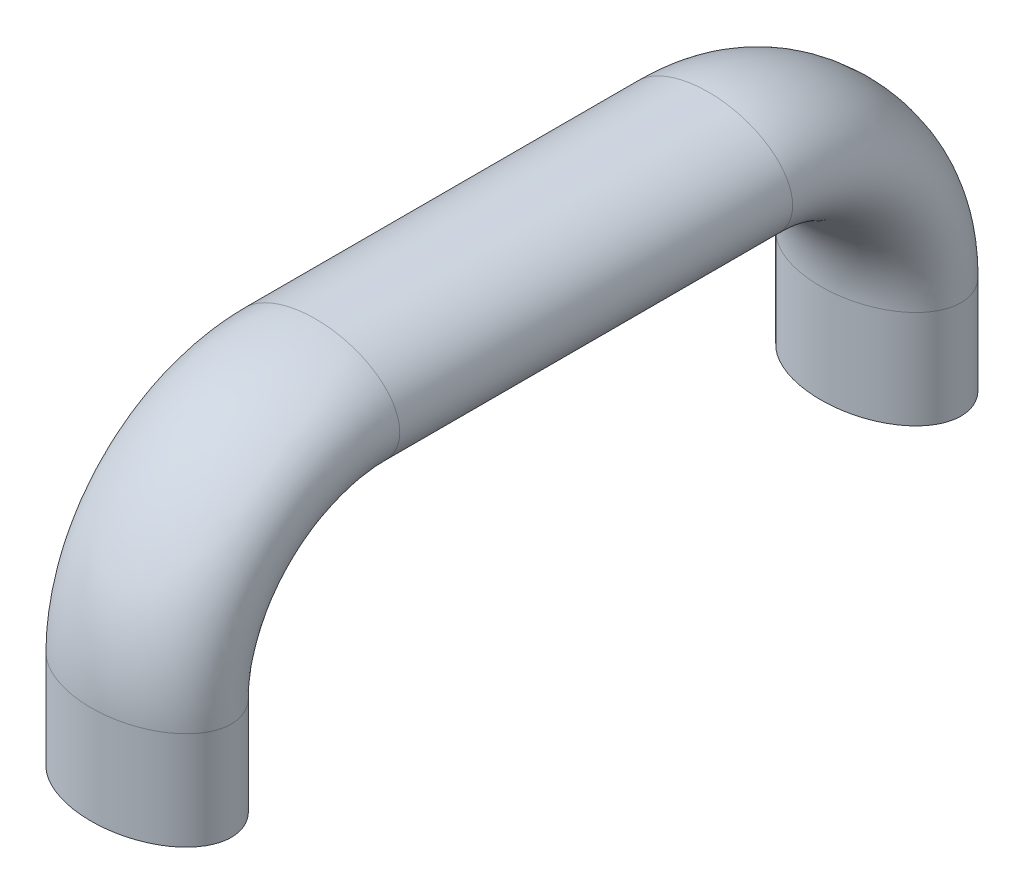
ISO-10303-21;
HEADER;
FILE_DESCRIPTION(('STEP AP214'),'2;1');
FILE_NAME('part.step','',(''),(''),'','','');
FILE_SCHEMA(('AUTOMOTIVE_DESIGN { 1 0 10303 214 1 1 1 1 }'));
ENDSEC;
DATA;
#1=APPLICATION_CONTEXT('core data for automotive mechanical design processes');
#2=APPLICATION_PROTOCOL_DEFINITION('international standard','automotive_design',2000,#1);
#3=PRODUCT_CONTEXT('',#1,'mechanical');
#4=PRODUCT('Part','Part','',(#3));
#5=PRODUCT_RELATED_PRODUCT_CATEGORY('part','',(#4));
#6=PRODUCT_DEFINITION_FORMATION('','',#4);
#7=PRODUCT_DEFINITION_CONTEXT('part definition',#1,'design');
#8=PRODUCT_DEFINITION('design','',#6,#7);
#9=PRODUCT_DEFINITION_SHAPE('','',#8);
#10=(LENGTH_UNIT() NAMED_UNIT(*) SI_UNIT(.MILLI.,.METRE.));
#11=(NAMED_UNIT(*) PLANE_ANGLE_UNIT() SI_UNIT($,.RADIAN.));
#12=(NAMED_UNIT(*) SI_UNIT($,.STERADIAN.) SOLID_ANGLE_UNIT());
#13=UNCERTAINTY_MEASURE_WITH_UNIT(LENGTH_MEASURE(1.E-05),#10,'distance_accuracy_value','');
#14=(GEOMETRIC_REPRESENTATION_CONTEXT(3) GLOBAL_UNCERTAINTY_ASSIGNED_CONTEXT((#13)) GLOBAL_UNIT_ASSIGNED_CONTEXT((#10,
#11,#12)) REPRESENTATION_CONTEXT('',''));
#15=CARTESIAN_POINT('',(0.,0.,0.));
#16=DIRECTION('',(0.,0.,1.));
#17=DIRECTION('',(1.,0.,0.));
#18=AXIS2_PLACEMENT_3D('',#15,#16,#17);
#19=CARTESIAN_POINT('',(0.,0.,-130.));
#20=DIRECTION('',(0.,-1.,0.));
#21=DIRECTION('',(0.,0.,-1.));
#22=AXIS2_PLACEMENT_3D('',#19,#20,#21);
#23=PLANE('',#22);
#24=CARTESIAN_POINT('',(0.,0.,-130.));
#25=DIRECTION('',(0.,-1.,0.));
#26=DIRECTION('',(1.,0.,0.));
#27=AXIS2_PLACEMENT_3D('',#24,#25,#26);
#28=ELLIPSE('',#27,15.,10.);
#29=CARTESIAN_POINT('',(15.,0.,-130.));
#30=VERTEX_POINT('',#29);
#31=EDGE_CURVE('E54',#30,#30,#28,.T.);
#32=ORIENTED_EDGE('',*,*,#31,.T.);
#33=EDGE_LOOP('',(#32));
#34=FACE_BOUND('',#33,.T.);
#35=ADVANCED_FACE('F42',(#34),#23,.T.);
#36=CARTESIAN_POINT('',(0.,0.,0.));
#37=DIRECTION('',(0.,1.,0.));
#38=DIRECTION('',(0.,0.,1.));
#39=AXIS2_PLACEMENT_3D('',#36,#37,#38);
#40=PLANE('',#39);
#41=CARTESIAN_POINT('',(0.,0.,0.));
#42=DIRECTION('',(0.,1.,0.));
#43=DIRECTION('',(1.,0.,0.));
#44=AXIS2_PLACEMENT_3D('',#41,#42,#43);
#45=ELLIPSE('',#44,15.,10.);
#46=CARTESIAN_POINT('',(15.,0.,0.));
#47=VERTEX_POINT('',#46);
#48=EDGE_CURVE('E13',#47,#47,#45,.T.);
#49=ORIENTED_EDGE('',*,*,#48,.F.);
#50=EDGE_LOOP('',(#49));
#51=FACE_BOUND('',#50,.T.);
#52=ADVANCED_FACE('F60',(#51),#40,.F.);
#53=CARTESIAN_POINT('',(15.,0.,-130.));
#54=CARTESIAN_POINT('',(15.,17.5,-130.));
#55=CARTESIAN_POINT('',(15.,0.,-110.));
#56=CARTESIAN_POINT('',(15.,17.5,-110.));
#57=CARTESIAN_POINT('',(-15.,0.,-110.));
#58=CARTESIAN_POINT('',(-15.,17.5,-110.));
#59=CARTESIAN_POINT('',(-15.,0.,-130.));
#60=CARTESIAN_POINT('',(-15.,17.5,-130.));
#61=CARTESIAN_POINT('',(-15.,0.,-150.));
#62=CARTESIAN_POINT('',(-15.,17.5,-150.));
#63=CARTESIAN_POINT('',(15.,0.,-150.));
#64=CARTESIAN_POINT('',(15.,17.5,-150.));
#65=CARTESIAN_POINT('',(15.,0.,-130.));
#66=CARTESIAN_POINT('',(15.,17.5,-130.));
#67=(BOUNDED_SURFACE() B_SPLINE_SURFACE(3,1,((#53,#54),(#55,#56),(#57,#58),(#59,#60),(#61,#62),
(#63,#64),(#65,#66)),.UNSPECIFIED.,.T.,.F.,.F.) B_SPLINE_SURFACE_WITH_KNOTS((4,3,4),(2,2),(0.,
0.5,1.),(0.,1.),.UNSPECIFIED.) GEOMETRIC_REPRESENTATION_ITEM() RATIONAL_B_SPLINE_SURFACE(((1.,
1.),(0.333333333333333,0.333333333333333),(0.333333333333333,0.333333333333333),(1.,1.),
(0.333333333333333,0.333333333333333),(0.333333333333333,0.333333333333333),(1.,1.))) REPRESENTATION_ITEM('') SURFACE());
#68=CARTESIAN_POINT('',(0.,17.5,-130.));
#69=DIRECTION('',(0.,-1.,0.));
#70=DIRECTION('',(1.,0.,0.));
#71=AXIS2_PLACEMENT_3D('',#68,#69,#70);
#72=ELLIPSE('',#71,15.,10.);
#73=CARTESIAN_POINT('',(15.,17.5,-130.));
#74=VERTEX_POINT('',#73);
#75=EDGE_CURVE('E129',#74,#74,#72,.T.);
#76=ORIENTED_EDGE('',*,*,#75,.T.);
#77=EDGE_LOOP('',(#76));
#78=FACE_BOUND('',#77,.T.);
#79=ORIENTED_EDGE('',*,*,#31,.F.);
#80=EDGE_LOOP('',(#79));
#81=FACE_BOUND('',#80,.T.);
#82=ADVANCED_FACE('F62',(#78,#81),#67,.F.);
#83=CARTESIAN_POINT('',(15.,17.5,-130.));
#84=CARTESIAN_POINT('',(15.,35.0735931288072,-130.));
#85=CARTESIAN_POINT('',(15.,47.5,-117.573593128807));
#86=CARTESIAN_POINT('',(15.,47.5,-100.));
#87=CARTESIAN_POINT('',(15.,17.5,-110.));
#88=CARTESIAN_POINT('',(15.,23.3578643762691,-110.));
#89=CARTESIAN_POINT('',(15.,27.5,-105.857864376269));
#90=CARTESIAN_POINT('',(15.,27.5,-100.));
#91=CARTESIAN_POINT('',(-15.,17.5,-110.));
#92=CARTESIAN_POINT('',(-15.,23.3578643762691,-110.));
#93=CARTESIAN_POINT('',(-15.,27.5,-105.857864376269));
#94=CARTESIAN_POINT('',(-15.,27.5,-100.));
#95=CARTESIAN_POINT('',(-15.,17.5,-130.));
#96=CARTESIAN_POINT('',(-15.,35.0735931288072,-130.));
#97=CARTESIAN_POINT('',(-15.,47.5,-117.573593128807));
#98=CARTESIAN_POINT('',(-15.,47.5,-100.));
#99=CARTESIAN_POINT('',(-15.,17.5,-150.));
#100=CARTESIAN_POINT('',(-15.,46.7893218813453,-150.));
#101=CARTESIAN_POINT('',(-15.,67.5,-129.289321881345));
#102=CARTESIAN_POINT('',(-15.,67.5,-100.));
#103=CARTESIAN_POINT('',(15.,17.5,-150.));
#104=CARTESIAN_POINT('',(15.,46.7893218813453,-150.));
#105=CARTESIAN_POINT('',(15.,67.5,-129.289321881345));
#106=CARTESIAN_POINT('',(15.,67.5,-100.));
#107=CARTESIAN_POINT('',(15.,17.5,-130.));
#108=CARTESIAN_POINT('',(15.,35.0735931288072,-130.));
#109=CARTESIAN_POINT('',(15.,47.5,-117.573593128807));
#110=CARTESIAN_POINT('',(15.,47.5,-100.));
#111=(BOUNDED_SURFACE() B_SPLINE_SURFACE(3,3,((#83,#84,#85,#86),(#87,#88,#89,#90),(#91,#92,#93,
#94),(#95,#96,#97,#98),(#99,#100,#101,#102),(#103,#104,#105,#106),(#107,#108,#109,#110)),
.UNSPECIFIED.,.T.,.F.,.F.) B_SPLINE_SURFACE_WITH_KNOTS((4,3,4),(4,4),(0.,0.5,1.),(0.,1.),
.UNSPECIFIED.) GEOMETRIC_REPRESENTATION_ITEM() RATIONAL_B_SPLINE_SURFACE(((1.,0.804737854124365,
0.804737854124365,1.),(0.333333333333333,0.268245951374788,0.268245951374788,0.333333333333333),
(0.333333333333333,0.268245951374788,0.268245951374788,0.333333333333333),(1.,0.804737854124365,
0.804737854124365,1.),(0.333333333333333,0.268245951374788,0.268245951374788,0.333333333333333),
(0.333333333333333,0.268245951374788,0.268245951374788,0.333333333333333),(1.,0.804737854124365,
0.804737854124365,1.))) REPRESENTATION_ITEM('') SURFACE());
#112=CARTESIAN_POINT('',(0.,47.5,-100.));
#113=DIRECTION('',(0.,0.,-1.));
#114=DIRECTION('',(1.,0.,0.));
#115=AXIS2_PLACEMENT_3D('',#112,#113,#114);
#116=ELLIPSE('',#115,15.,10.);
#117=CARTESIAN_POINT('',(15.,47.5,-100.));
#118=VERTEX_POINT('',#117);
#119=EDGE_CURVE('E126',#118,#118,#116,.T.);
#120=ORIENTED_EDGE('',*,*,#119,.T.);
#121=EDGE_LOOP('',(#120));
#122=FACE_BOUND('',#121,.T.);
#123=ORIENTED_EDGE('',*,*,#75,.F.);
#124=EDGE_LOOP('',(#123));
#125=FACE_BOUND('',#124,.T.);
#126=ADVANCED_FACE('F67',(#122,#125),#111,.F.);
#127=CARTESIAN_POINT('',(15.,47.5,-100.));
#128=CARTESIAN_POINT('',(15.,47.5,-30.));
#129=CARTESIAN_POINT('',(15.,27.5,-100.));
#130=CARTESIAN_POINT('',(15.,27.5,-30.));
#131=CARTESIAN_POINT('',(-15.,27.5,-100.));
#132=CARTESIAN_POINT('',(-15.,27.5,-30.));
#133=CARTESIAN_POINT('',(-15.,47.5,-100.));
#134=CARTESIAN_POINT('',(-15.,47.5,-30.));
#135=CARTESIAN_POINT('',(-15.,67.5,-100.));
#136=CARTESIAN_POINT('',(-15.,67.5,-30.));
#137=CARTESIAN_POINT('',(15.,67.5,-100.));
#138=CARTESIAN_POINT('',(15.,67.5,-30.));
#139=CARTESIAN_POINT('',(15.,47.5,-100.));
#140=CARTESIAN_POINT('',(15.,47.5,-30.));
#141=(BOUNDED_SURFACE() B_SPLINE_SURFACE(3,1,((#127,#128),(#129,#130),(#131,#132),(#133,#134),
(#135,#136),(#137,#138),(#139,#140)),.UNSPECIFIED.,.T.,.F.,.F.) B_SPLINE_SURFACE_WITH_KNOTS((4,
3,4),(2,2),(0.,0.5,1.),(0.,1.),
.UNSPECIFIED.) GEOMETRIC_REPRESENTATION_ITEM() RATIONAL_B_SPLINE_SURFACE(((1.,1.),
(0.333333333333333,0.333333333333333),(0.333333333333333,0.333333333333333),(1.,1.),
(0.333333333333333,0.333333333333333),(0.333333333333333,0.333333333333333),(1.,1.))) REPRESENTATION_ITEM('') SURFACE());
#142=CARTESIAN_POINT('',(0.,47.5,-30.));
#143=DIRECTION('',(0.,0.,-1.));
#144=DIRECTION('',(1.,0.,0.));
#145=AXIS2_PLACEMENT_3D('',#142,#143,#144);
#146=ELLIPSE('',#145,15.,10.);
#147=CARTESIAN_POINT('',(15.,47.5,-30.));
#148=VERTEX_POINT('',#147);
#149=EDGE_CURVE('E131',#148,#148,#146,.T.);
#150=ORIENTED_EDGE('',*,*,#149,.T.);
#151=EDGE_LOOP('',(#150));
#152=FACE_BOUND('',#151,.T.);
#153=ORIENTED_EDGE('',*,*,#119,.F.);
#154=EDGE_LOOP('',(#153));
#155=FACE_BOUND('',#154,.T.);
#156=ADVANCED_FACE('F77',(#152,#155),#141,.F.);
#157=CARTESIAN_POINT('',(15.,47.5,-30.));
#158=CARTESIAN_POINT('',(15.,47.5,-12.4264068711929));
#159=CARTESIAN_POINT('',(15.,35.0735931288072,0.));
#160=CARTESIAN_POINT('',(15.,17.5,0.));
#161=CARTESIAN_POINT('',(15.,27.5,-30.));
#162=CARTESIAN_POINT('',(15.,27.5,-24.1421356237309));
#163=CARTESIAN_POINT('',(15.,23.3578643762691,-20.));
#164=CARTESIAN_POINT('',(15.,17.5,-20.));
#165=CARTESIAN_POINT('',(-15.,27.5,-30.));
#166=CARTESIAN_POINT('',(-15.,27.5,-24.1421356237309));
#167=CARTESIAN_POINT('',(-15.,23.3578643762691,-20.));
#168=CARTESIAN_POINT('',(-15.,17.5,-20.));
#169=CARTESIAN_POINT('',(-15.,47.5,-30.));
#170=CARTESIAN_POINT('',(-15.,47.5,-12.4264068711929));
#171=CARTESIAN_POINT('',(-15.,35.0735931288072,0.));
#172=CARTESIAN_POINT('',(-15.,17.5,0.));
#173=CARTESIAN_POINT('',(-15.,67.5,-30.));
#174=CARTESIAN_POINT('',(-15.,67.5,-0.710678118654762));
#175=CARTESIAN_POINT('',(-15.,46.7893218813453,20.));
#176=CARTESIAN_POINT('',(-15.,17.5,20.));
#177=CARTESIAN_POINT('',(15.,67.5,-30.));
#178=CARTESIAN_POINT('',(15.,67.5,-0.710678118654762));
#179=CARTESIAN_POINT('',(15.,46.7893218813453,20.));
#180=CARTESIAN_POINT('',(15.,17.5,20.));
#181=CARTESIAN_POINT('',(15.,47.5,-30.));
#182=CARTESIAN_POINT('',(15.,47.5,-12.4264068711929));
#183=CARTESIAN_POINT('',(15.,35.0735931288072,0.));
#184=CARTESIAN_POINT('',(15.,17.5,0.));
#185=(BOUNDED_SURFACE() B_SPLINE_SURFACE(3,3,((#157,#158,#159,#160),(#161,#162,#163,#164),(#165,
#166,#167,#168),(#169,#170,#171,#172),(#173,#174,#175,#176),(#177,#178,#179,#180),(#181,#182,
#183,#184)),.UNSPECIFIED.,.T.,.F.,.F.) B_SPLINE_SURFACE_WITH_KNOTS((4,3,4),(4,4),(0.,0.5,1.),
(0.,1.),.UNSPECIFIED.) GEOMETRIC_REPRESENTATION_ITEM() RATIONAL_B_SPLINE_SURFACE(((1.,
0.804737854124365,0.804737854124365,1.),(0.333333333333333,0.268245951374788,0.268245951374788,
0.333333333333333),(0.333333333333333,0.268245951374788,0.268245951374788,0.333333333333333),
(1.,0.804737854124365,0.804737854124365,1.),(0.333333333333333,0.268245951374788,
0.268245951374788,0.333333333333333),(0.333333333333333,0.268245951374788,0.268245951374788,
0.333333333333333),(1.,0.804737854124365,0.804737854124365,1.))) REPRESENTATION_ITEM('') SURFACE());
#186=CARTESIAN_POINT('',(0.,17.5,0.));
#187=DIRECTION('',(0.,1.,0.));
#188=DIRECTION('',(1.,0.,0.));
#189=AXIS2_PLACEMENT_3D('',#186,#187,#188);
#190=ELLIPSE('',#189,15.,10.);
#191=CARTESIAN_POINT('',(15.,17.5,0.));
#192=VERTEX_POINT('',#191);
#193=EDGE_CURVE('E49',#192,#192,#190,.T.);
#194=ORIENTED_EDGE('',*,*,#193,.T.);
#195=EDGE_LOOP('',(#194));
#196=FACE_BOUND('',#195,.T.);
#197=ORIENTED_EDGE('',*,*,#149,.F.);
#198=EDGE_LOOP('',(#197));
#199=FACE_BOUND('',#198,.T.);
#200=ADVANCED_FACE('F73',(#196,#199),#185,.F.);
#201=CARTESIAN_POINT('',(15.,17.5,0.));
#202=CARTESIAN_POINT('',(15.,0.,0.));
#203=CARTESIAN_POINT('',(15.,17.5,-20.));
#204=CARTESIAN_POINT('',(15.,0.,-20.));
#205=CARTESIAN_POINT('',(-15.,17.5,-20.));
#206=CARTESIAN_POINT('',(-15.,0.,-20.));
#207=CARTESIAN_POINT('',(-15.,17.5,0.));
#208=CARTESIAN_POINT('',(-15.,0.,0.));
#209=CARTESIAN_POINT('',(-15.,17.5,20.));
#210=CARTESIAN_POINT('',(-15.,0.,20.));
#211=CARTESIAN_POINT('',(15.,17.5,20.));
#212=CARTESIAN_POINT('',(15.,0.,20.));
#213=CARTESIAN_POINT('',(15.,17.5,0.));
#214=CARTESIAN_POINT('',(15.,0.,0.));
#215=(BOUNDED_SURFACE() B_SPLINE_SURFACE(3,1,((#201,#202),(#203,#204),(#205,#206),(#207,#208),
(#209,#210),(#211,#212),(#213,#214)),.UNSPECIFIED.,.T.,.F.,.F.) B_SPLINE_SURFACE_WITH_KNOTS((4,
3,4),(2,2),(0.,0.5,1.),(0.,1.),
.UNSPECIFIED.) GEOMETRIC_REPRESENTATION_ITEM() RATIONAL_B_SPLINE_SURFACE(((1.,1.),
(0.333333333333333,0.333333333333333),(0.333333333333333,0.333333333333333),(1.,1.),
(0.333333333333333,0.333333333333333),(0.333333333333333,0.333333333333333),(1.,1.))) REPRESENTATION_ITEM('') SURFACE());
#216=ORIENTED_EDGE('',*,*,#48,.T.);
#217=EDGE_LOOP('',(#216));
#218=FACE_BOUND('',#217,.T.);
#219=ORIENTED_EDGE('',*,*,#193,.F.);
#220=EDGE_LOOP('',(#219));
#221=FACE_BOUND('',#220,.T.);
#222=ADVANCED_FACE('F57',(#218,#221),#215,.F.);
#223=CLOSED_SHELL('',(#35,#52,#82,#126,#156,#200,#222));
#224=MANIFOLD_SOLID_BREP('B2',#223);
#225=ADVANCED_BREP_SHAPE_REPRESENTATION('',(#18,#224),#14);
#226=SHAPE_DEFINITION_REPRESENTATION(#9,#225);
ENDSEC;
END-ISO-10303-21;
